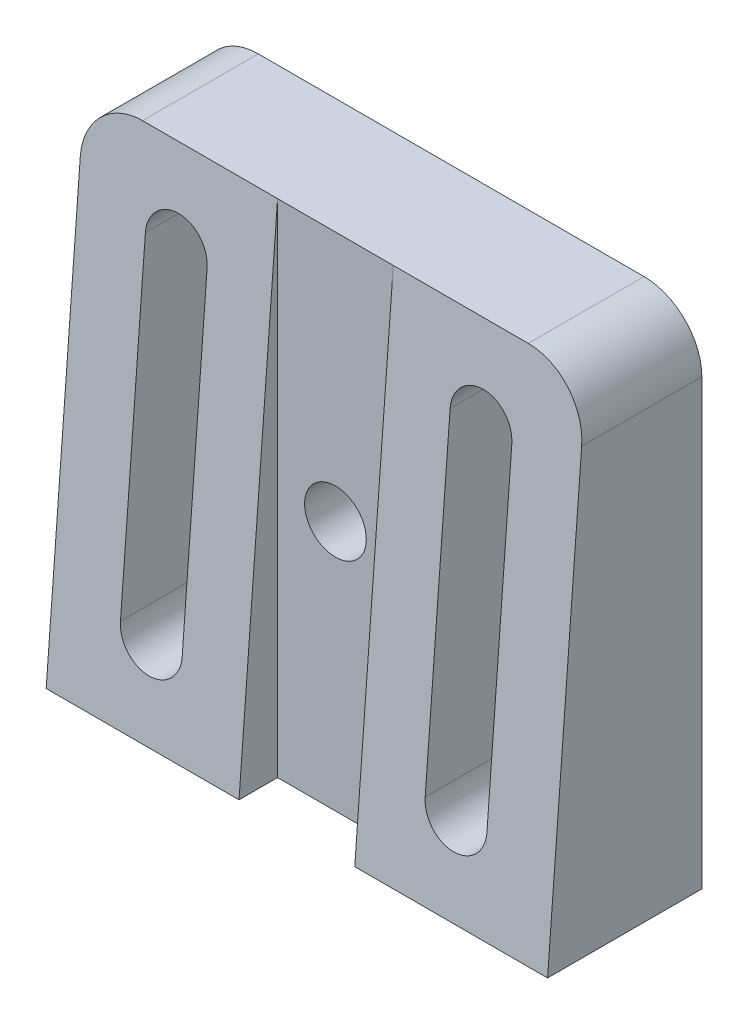
ISO-10303-21;
HEADER;
FILE_DESCRIPTION(('STEP AP214'),'2;1');
FILE_NAME('part.step','',(''),(''),'','','');
FILE_SCHEMA(('AUTOMOTIVE_DESIGN { 1 0 10303 214 1 1 1 1 }'));
ENDSEC;
DATA;
#1=APPLICATION_CONTEXT('core data for automotive mechanical design processes');
#2=APPLICATION_PROTOCOL_DEFINITION('international standard','automotive_design',2000,#1);
#3=PRODUCT_CONTEXT('',#1,'mechanical');
#4=PRODUCT('Part','Part','',(#3));
#5=PRODUCT_RELATED_PRODUCT_CATEGORY('part','',(#4));
#6=PRODUCT_DEFINITION_FORMATION('','',#4);
#7=PRODUCT_DEFINITION_CONTEXT('part definition',#1,'design');
#8=PRODUCT_DEFINITION('design','',#6,#7);
#9=PRODUCT_DEFINITION_SHAPE('','',#8);
#10=(LENGTH_UNIT() NAMED_UNIT(*) SI_UNIT(.MILLI.,.METRE.));
#11=(NAMED_UNIT(*) PLANE_ANGLE_UNIT() SI_UNIT($,.RADIAN.));
#12=(NAMED_UNIT(*) SI_UNIT($,.STERADIAN.) SOLID_ANGLE_UNIT());
#13=UNCERTAINTY_MEASURE_WITH_UNIT(LENGTH_MEASURE(1.E-05),#10,'distance_accuracy_value','');
#14=(GEOMETRIC_REPRESENTATION_CONTEXT(3) GLOBAL_UNCERTAINTY_ASSIGNED_CONTEXT((#13)) GLOBAL_UNIT_ASSIGNED_CONTEXT((#10,
#11,#12)) REPRESENTATION_CONTEXT('',''));
#15=CARTESIAN_POINT('',(0.,0.,0.));
#16=DIRECTION('',(0.,0.,1.));
#17=DIRECTION('',(1.,0.,0.));
#18=AXIS2_PLACEMENT_3D('',#15,#16,#17);
#19=CARTESIAN_POINT('',(-13.,-13.,8.));
#20=DIRECTION('',(0.,0.076696498884737,0.997054485501581));
#21=DIRECTION('',(0.,-0.997054485501582,0.0766964988847371));
#22=AXIS2_PLACEMENT_3D('',#19,#20,#21);
#23=PLANE('',#22);
#24=DIRECTION('',(0.,0.997054485501582,-0.0766964988847371));
#25=VECTOR('',#24,1.);
#26=CARTESIAN_POINT('',(-6.3,8.27411764705882,6.36352941176471));
#27=LINE('',#26,#25);
#28=CARTESIAN_POINT('',(-6.3,-8.4,7.64615384615385));
#29=VERTEX_POINT('',#28);
#30=CARTESIAN_POINT('',(-6.3,8.4,6.35384615384615));
#31=VERTEX_POINT('',#30);
#32=EDGE_CURVE('E207',#29,#31,#27,.T.);
#33=ORIENTED_EDGE('',*,*,#32,.F.);
#34=CARTESIAN_POINT('',(-7.9,-8.4,7.64615384615385));
#35=DIRECTION('',(0.,0.076696498884737,0.997054485501581));
#36=DIRECTION('',(0.,0.997054485501582,-0.0766964988847371));
#37=AXIS2_PLACEMENT_3D('',#34,#35,#36);
#38=ELLIPSE('',#37,1.60472674589604,1.6);
#39=CARTESIAN_POINT('',(-9.5,-8.4,7.64615384615385));
#40=VERTEX_POINT('',#39);
#41=EDGE_CURVE('E210',#40,#29,#38,.T.);
#42=ORIENTED_EDGE('',*,*,#41,.F.);
#43=DIRECTION('',(0.,-0.997054485501582,0.0766964988847371));
#44=VECTOR('',#43,1.);
#45=CARTESIAN_POINT('',(-9.50000000000001,8.27411764705882,6.36352941176471));
#46=LINE('',#45,#44);
#47=CARTESIAN_POINT('',(-9.50000000000001,8.4,6.35384615384615));
#48=VERTEX_POINT('',#47);
#49=EDGE_CURVE('E213',#48,#40,#46,.T.);
#50=ORIENTED_EDGE('',*,*,#49,.F.);
#51=CARTESIAN_POINT('',(-7.9,8.4,6.35384615384615));
#52=DIRECTION('',(0.,0.076696498884737,0.997054485501581));
#53=DIRECTION('',(0.,0.997054485501582,-0.0766964988847371));
#54=AXIS2_PLACEMENT_3D('',#51,#52,#53);
#55=ELLIPSE('',#54,1.60472674589604,1.6);
#56=EDGE_CURVE('E216',#31,#48,#55,.T.);
#57=ORIENTED_EDGE('',*,*,#56,.F.);
#58=EDGE_LOOP('',(#33,#42,#50,#57));
#59=FACE_BOUND('',#58,.T.);
#60=DIRECTION('',(1.,0.,0.));
#61=VECTOR('',#60,1.);
#62=CARTESIAN_POINT('',(-13.,13.,6.));
#63=LINE('',#62,#61);
#64=CARTESIAN_POINT('',(-10.,13.,6.));
#65=VERTEX_POINT('',#64);
#66=CARTESIAN_POINT('',(-3.,13.,6.));
#67=VERTEX_POINT('',#66);
#68=EDGE_CURVE('E196',#65,#67,#63,.T.);
#69=ORIENTED_EDGE('',*,*,#68,.F.);
#70=CARTESIAN_POINT('',(-10.,10.,6.23076923076923));
#71=DIRECTION('',(0.,0.076696498884737,0.997054485501581));
#72=DIRECTION('',(0.,0.997054485501582,-0.0766964988847371));
#73=AXIS2_PLACEMENT_3D('',#70,#71,#72);
#74=ELLIPSE('',#73,3.00886264855507,3.);
#75=CARTESIAN_POINT('',(-13.,10.,6.23076923076923));
#76=VERTEX_POINT('',#75);
#77=EDGE_CURVE('E12',#65,#76,#74,.T.);
#78=ORIENTED_EDGE('',*,*,#77,.T.);
#79=DIRECTION('',(0.,-0.997054485501582,0.076696498884737));
#80=VECTOR('',#79,1.);
#81=CARTESIAN_POINT('',(-13.,-13.,8.));
#82=LINE('',#81,#80);
#83=CARTESIAN_POINT('',(-13.,-13.,8.));
#84=VERTEX_POINT('',#83);
#85=EDGE_CURVE('E193',#76,#84,#82,.T.);
#86=ORIENTED_EDGE('',*,*,#85,.T.);
#87=DIRECTION('',(1.,0.,0.));
#88=VECTOR('',#87,1.);
#89=CARTESIAN_POINT('',(-13.,-13.,8.));
#90=LINE('',#89,#88);
#91=CARTESIAN_POINT('',(-3.,-13.,8.));
#92=VERTEX_POINT('',#91);
#93=EDGE_CURVE('E260',#84,#92,#90,.T.);
#94=ORIENTED_EDGE('',*,*,#93,.T.);
#95=DIRECTION('',(0.,0.997054485501582,-0.0766964988847371));
#96=VECTOR('',#95,1.);
#97=CARTESIAN_POINT('',(-3.,-13.,8.));
#98=LINE('',#97,#96);
#99=EDGE_CURVE('E161',#92,#67,#98,.T.);
#100=ORIENTED_EDGE('',*,*,#99,.T.);
#101=EDGE_LOOP('',(#69,#78,#86,#94,#100));
#102=FACE_BOUND('',#101,.T.);
#103=ADVANCED_FACE('F36',(#59,#102),#23,.T.);
#104=CARTESIAN_POINT('',(0.,0.,0.));
#105=DIRECTION('',(0.,0.,-1.));
#106=DIRECTION('',(-1.,0.,0.));
#107=AXIS2_PLACEMENT_3D('',#104,#105,#106);
#108=CYLINDRICAL_SURFACE('',#107,1.59999999999999);
#109=CARTESIAN_POINT('',(0.,0.,0.));
#110=DIRECTION('',(0.,0.,-1.));
#111=DIRECTION('',(-1.,0.,0.));
#112=AXIS2_PLACEMENT_3D('',#109,#110,#111);
#113=CIRCLE('',#112,1.59999999999999);
#114=CARTESIAN_POINT('',(-1.59999999999999,0.,0.));
#115=VERTEX_POINT('',#114);
#116=EDGE_CURVE('E166',#115,#115,#113,.T.);
#117=ORIENTED_EDGE('',*,*,#116,.T.);
#118=EDGE_LOOP('',(#117));
#119=FACE_BOUND('',#118,.T.);
#120=CARTESIAN_POINT('',(0.,0.,6.));
#121=DIRECTION('',(0.,0.,1.));
#122=DIRECTION('',(1.,0.,0.));
#123=AXIS2_PLACEMENT_3D('',#120,#121,#122);
#124=CIRCLE('',#123,1.59999999999999);
#125=CARTESIAN_POINT('',(1.59999999999999,0.,6.));
#126=VERTEX_POINT('',#125);
#127=EDGE_CURVE('E181',#126,#126,#124,.F.);
#128=ORIENTED_EDGE('',*,*,#127,.F.);
#129=EDGE_LOOP('',(#128));
#130=FACE_BOUND('',#129,.T.);
#131=ADVANCED_FACE('F336',(#119,#130),#108,.F.);
#132=CARTESIAN_POINT('',(0.,0.,0.));
#133=DIRECTION('',(0.,0.,1.));
#134=DIRECTION('',(1.,0.,0.));
#135=AXIS2_PLACEMENT_3D('',#132,#133,#134);
#136=PLANE('',#135);
#137=DIRECTION('',(-1.,0.,0.));
#138=VECTOR('',#137,1.);
#139=CARTESIAN_POINT('',(-13.,13.,0.));
#140=LINE('',#139,#138);
#141=CARTESIAN_POINT('',(9.99999999999999,13.,0.));
#142=VERTEX_POINT('',#141);
#143=CARTESIAN_POINT('',(-10.,13.,0.));
#144=VERTEX_POINT('',#143);
#145=EDGE_CURVE('E269',#142,#144,#140,.T.);
#146=ORIENTED_EDGE('',*,*,#145,.F.);
#147=CARTESIAN_POINT('',(10.,10.,0.));
#148=DIRECTION('',(0.,0.,1.));
#149=DIRECTION('',(1.,0.,0.));
#150=AXIS2_PLACEMENT_3D('',#147,#148,#149);
#151=CIRCLE('',#150,3.);
#152=CARTESIAN_POINT('',(13.,10.,0.));
#153=VERTEX_POINT('',#152);
#154=EDGE_CURVE('E291',#142,#153,#151,.F.);
#155=ORIENTED_EDGE('',*,*,#154,.T.);
#156=DIRECTION('',(0.,1.,0.));
#157=VECTOR('',#156,1.);
#158=CARTESIAN_POINT('',(13.,13.,0.));
#159=LINE('',#158,#157);
#160=CARTESIAN_POINT('',(13.,-13.,0.));
#161=VERTEX_POINT('',#160);
#162=EDGE_CURVE('E267',#161,#153,#159,.T.);
#163=ORIENTED_EDGE('',*,*,#162,.F.);
#164=DIRECTION('',(1.,0.,0.));
#165=VECTOR('',#164,1.);
#166=CARTESIAN_POINT('',(-13.,-13.,0.));
#167=LINE('',#166,#165);
#168=CARTESIAN_POINT('',(-13.,-13.,0.));
#169=VERTEX_POINT('',#168);
#170=EDGE_CURVE('E265',#169,#161,#167,.T.);
#171=ORIENTED_EDGE('',*,*,#170,.F.);
#172=DIRECTION('',(0.,-1.,0.));
#173=VECTOR('',#172,1.);
#174=CARTESIAN_POINT('',(-13.,13.,0.));
#175=LINE('',#174,#173);
#176=CARTESIAN_POINT('',(-13.,10.,0.));
#177=VERTEX_POINT('',#176);
#178=EDGE_CURVE('E259',#177,#169,#175,.T.);
#179=ORIENTED_EDGE('',*,*,#178,.F.);
#180=CARTESIAN_POINT('',(-10.,10.,0.));
#181=DIRECTION('',(0.,0.,1.));
#182=DIRECTION('',(1.,0.,0.));
#183=AXIS2_PLACEMENT_3D('',#180,#181,#182);
#184=CIRCLE('',#183,3.);
#185=EDGE_CURVE('E289',#177,#144,#184,.F.);
#186=ORIENTED_EDGE('',*,*,#185,.T.);
#187=EDGE_LOOP('',(#146,#155,#163,#171,#179,#186));
#188=FACE_BOUND('',#187,.T.);
#189=CARTESIAN_POINT('',(7.9,8.4,0.));
#190=DIRECTION('',(0.,0.,1.));
#191=DIRECTION('',(1.,0.,0.));
#192=AXIS2_PLACEMENT_3D('',#189,#190,#191);
#193=CIRCLE('',#192,1.6);
#194=CARTESIAN_POINT('',(9.50000000000001,8.4,0.));
#195=VERTEX_POINT('',#194);
#196=CARTESIAN_POINT('',(6.3,8.4,0.));
#197=VERTEX_POINT('',#196);
#198=EDGE_CURVE('E219',#195,#197,#193,.T.);
#199=ORIENTED_EDGE('',*,*,#198,.T.);
#200=DIRECTION('',(0.,-1.,0.));
#201=VECTOR('',#200,1.);
#202=CARTESIAN_POINT('',(6.3,8.4,0.));
#203=LINE('',#202,#201);
#204=CARTESIAN_POINT('',(6.30000000000001,-8.4,0.));
#205=VERTEX_POINT('',#204);
#206=EDGE_CURVE('E222',#197,#205,#203,.T.);
#207=ORIENTED_EDGE('',*,*,#206,.T.);
#208=CARTESIAN_POINT('',(7.90000000000001,-8.4,0.));
#209=DIRECTION('',(0.,0.,1.));
#210=DIRECTION('',(1.,0.,0.));
#211=AXIS2_PLACEMENT_3D('',#208,#209,#210);
#212=CIRCLE('',#211,1.6);
#213=CARTESIAN_POINT('',(9.50000000000001,-8.4,0.));
#214=VERTEX_POINT('',#213);
#215=EDGE_CURVE('E225',#205,#214,#212,.T.);
#216=ORIENTED_EDGE('',*,*,#215,.T.);
#217=DIRECTION('',(0.,1.,0.));
#218=VECTOR('',#217,1.);
#219=CARTESIAN_POINT('',(9.50000000000001,8.4,0.));
#220=LINE('',#219,#218);
#221=EDGE_CURVE('E228',#214,#195,#220,.T.);
#222=ORIENTED_EDGE('',*,*,#221,.T.);
#223=EDGE_LOOP('',(#199,#207,#216,#222));
#224=FACE_BOUND('',#223,.T.);
#225=ORIENTED_EDGE('',*,*,#116,.F.);
#226=EDGE_LOOP('',(#225));
#227=FACE_BOUND('',#226,.T.);
#228=CARTESIAN_POINT('',(-7.9,8.4,0.));
#229=DIRECTION('',(0.,0.,1.));
#230=DIRECTION('',(1.,0.,0.));
#231=AXIS2_PLACEMENT_3D('',#228,#229,#230);
#232=CIRCLE('',#231,1.6);
#233=CARTESIAN_POINT('',(-6.3,8.4,0.));
#234=VERTEX_POINT('',#233);
#235=CARTESIAN_POINT('',(-9.50000000000001,8.4,0.));
#236=VERTEX_POINT('',#235);
#237=EDGE_CURVE('E239',#234,#236,#232,.T.);
#238=ORIENTED_EDGE('',*,*,#237,.T.);
#239=DIRECTION('',(0.,-1.,0.));
#240=VECTOR('',#239,1.);
#241=CARTESIAN_POINT('',(-9.50000000000001,8.4,0.));
#242=LINE('',#241,#240);
#243=CARTESIAN_POINT('',(-9.5,-8.4,0.));
#244=VERTEX_POINT('',#243);
#245=EDGE_CURVE('E242',#236,#244,#242,.T.);
#246=ORIENTED_EDGE('',*,*,#245,.T.);
#247=CARTESIAN_POINT('',(-7.9,-8.4,0.));
#248=DIRECTION('',(0.,0.,1.));
#249=DIRECTION('',(1.,0.,0.));
#250=AXIS2_PLACEMENT_3D('',#247,#248,#249);
#251=CIRCLE('',#250,1.6);
#252=CARTESIAN_POINT('',(-6.3,-8.4,0.));
#253=VERTEX_POINT('',#252);
#254=EDGE_CURVE('E245',#244,#253,#251,.T.);
#255=ORIENTED_EDGE('',*,*,#254,.T.);
#256=DIRECTION('',(0.,1.,0.));
#257=VECTOR('',#256,1.);
#258=CARTESIAN_POINT('',(-6.3,8.4,0.));
#259=LINE('',#258,#257);
#260=EDGE_CURVE('E248',#253,#234,#259,.T.);
#261=ORIENTED_EDGE('',*,*,#260,.T.);
#262=EDGE_LOOP('',(#238,#246,#255,#261));
#263=FACE_BOUND('',#262,.T.);
#264=ADVANCED_FACE('F305',(#188,#224,#227,#263),#136,.F.);
#265=CARTESIAN_POINT('',(-13.,13.,8.));
#266=DIRECTION('',(1.,0.,0.));
#267=DIRECTION('',(0.,0.,-1.));
#268=AXIS2_PLACEMENT_3D('',#265,#266,#267);
#269=PLANE('',#268);
#270=ORIENTED_EDGE('',*,*,#85,.F.);
#271=DIRECTION('',(0.,0.,-1.));
#272=VECTOR('',#271,1.);
#273=CARTESIAN_POINT('',(-13.,10.,8.));
#274=LINE('',#273,#272);
#275=EDGE_CURVE('E44',#76,#177,#274,.T.);
#276=ORIENTED_EDGE('',*,*,#275,.T.);
#277=ORIENTED_EDGE('',*,*,#178,.T.);
#278=DIRECTION('',(0.,0.,-1.));
#279=VECTOR('',#278,1.);
#280=CARTESIAN_POINT('',(-13.,-13.,8.));
#281=LINE('',#280,#279);
#282=EDGE_CURVE('E274',#84,#169,#281,.T.);
#283=ORIENTED_EDGE('',*,*,#282,.F.);
#284=EDGE_LOOP('',(#270,#276,#277,#283));
#285=FACE_BOUND('',#284,.T.);
#286=ADVANCED_FACE('F299',(#285),#269,.F.);
#287=CARTESIAN_POINT('',(13.,13.,8.));
#288=DIRECTION('',(-1.,0.,0.));
#289=DIRECTION('',(0.,0.,1.));
#290=AXIS2_PLACEMENT_3D('',#287,#288,#289);
#291=PLANE('',#290);
#292=ORIENTED_EDGE('',*,*,#162,.T.);
#293=DIRECTION('',(0.,0.,-1.));
#294=VECTOR('',#293,1.);
#295=CARTESIAN_POINT('',(13.,10.,8.));
#296=LINE('',#295,#294);
#297=CARTESIAN_POINT('',(13.,10.,6.23076923076923));
#298=VERTEX_POINT('',#297);
#299=EDGE_CURVE('E57',#153,#298,#296,.F.);
#300=ORIENTED_EDGE('',*,*,#299,.T.);
#301=DIRECTION('',(0.,-0.997054485501582,0.076696498884737));
#302=VECTOR('',#301,1.);
#303=CARTESIAN_POINT('',(13.,-13.,8.));
#304=LINE('',#303,#302);
#305=CARTESIAN_POINT('',(13.,-13.,8.));
#306=VERTEX_POINT('',#305);
#307=EDGE_CURVE('E191',#298,#306,#304,.T.);
#308=ORIENTED_EDGE('',*,*,#307,.T.);
#309=DIRECTION('',(0.,0.,-1.));
#310=VECTOR('',#309,1.);
#311=CARTESIAN_POINT('',(13.,-13.,8.));
#312=LINE('',#311,#310);
#313=EDGE_CURVE('E262',#306,#161,#312,.T.);
#314=ORIENTED_EDGE('',*,*,#313,.T.);
#315=EDGE_LOOP('',(#292,#300,#308,#314));
#316=FACE_BOUND('',#315,.T.);
#317=ADVANCED_FACE('F315',(#316),#291,.F.);
#318=CARTESIAN_POINT('',(-13.,13.,8.));
#319=DIRECTION('',(0.,-1.,0.));
#320=DIRECTION('',(0.,0.,-1.));
#321=AXIS2_PLACEMENT_3D('',#318,#319,#320);
#322=PLANE('',#321);
#323=CARTESIAN_POINT('',(2.99999999999999,13.,6.));
#324=VERTEX_POINT('',#323);
#325=CARTESIAN_POINT('',(9.99999999999999,13.,6.));
#326=VERTEX_POINT('',#325);
#327=EDGE_CURVE('E195',#324,#326,#63,.T.);
#328=ORIENTED_EDGE('',*,*,#327,.T.);
#329=DIRECTION('',(0.,0.,-1.));
#330=VECTOR('',#329,1.);
#331=CARTESIAN_POINT('',(10.,13.,8.));
#332=LINE('',#331,#330);
#333=EDGE_CURVE('E286',#326,#142,#332,.T.);
#334=ORIENTED_EDGE('',*,*,#333,.T.);
#335=ORIENTED_EDGE('',*,*,#145,.T.);
#336=DIRECTION('',(0.,0.,-1.));
#337=VECTOR('',#336,1.);
#338=CARTESIAN_POINT('',(-10.,13.,8.));
#339=LINE('',#338,#337);
#340=EDGE_CURVE('E284',#144,#65,#339,.F.);
#341=ORIENTED_EDGE('',*,*,#340,.T.);
#342=ORIENTED_EDGE('',*,*,#68,.T.);
#343=DIRECTION('',(1.,0.,0.));
#344=VECTOR('',#343,1.);
#345=CARTESIAN_POINT('',(-3.,13.,6.));
#346=LINE('',#345,#344);
#347=EDGE_CURVE('E175',#67,#324,#346,.T.);
#348=ORIENTED_EDGE('',*,*,#347,.T.);
#349=EDGE_LOOP('',(#328,#334,#335,#341,#342,#348));
#350=FACE_BOUND('',#349,.T.);
#351=ADVANCED_FACE('F312',(#350),#322,.F.);
#352=CARTESIAN_POINT('',(-7.9,8.4,8.));
#353=DIRECTION('',(0.,0.,-1.));
#354=DIRECTION('',(-1.,0.,0.));
#355=AXIS2_PLACEMENT_3D('',#352,#353,#354);
#356=CYLINDRICAL_SURFACE('',#355,1.6);
#357=DIRECTION('',(0.,0.,-1.));
#358=VECTOR('',#357,1.);
#359=CARTESIAN_POINT('',(-6.3,8.4,8.));
#360=LINE('',#359,#358);
#361=EDGE_CURVE('E251',#31,#234,#360,.T.);
#362=ORIENTED_EDGE('',*,*,#361,.F.);
#363=ORIENTED_EDGE('',*,*,#56,.T.);
#364=DIRECTION('',(0.,0.,-1.));
#365=VECTOR('',#364,1.);
#366=CARTESIAN_POINT('',(-9.50000000000001,8.4,8.));
#367=LINE('',#366,#365);
#368=EDGE_CURVE('E257',#48,#236,#367,.T.);
#369=ORIENTED_EDGE('',*,*,#368,.T.);
#370=ORIENTED_EDGE('',*,*,#237,.F.);
#371=EDGE_LOOP('',(#362,#363,#369,#370));
#372=FACE_BOUND('',#371,.T.);
#373=ADVANCED_FACE('F385',(#372),#356,.F.);
#374=CARTESIAN_POINT('',(-9.50000000000001,8.4,8.));
#375=DIRECTION('',(1.,0.,0.));
#376=DIRECTION('',(0.,1.,0.));
#377=AXIS2_PLACEMENT_3D('',#374,#375,#376);
#378=PLANE('',#377);
#379=ORIENTED_EDGE('',*,*,#368,.F.);
#380=ORIENTED_EDGE('',*,*,#49,.T.);
#381=DIRECTION('',(0.,0.,-1.));
#382=VECTOR('',#381,1.);
#383=CARTESIAN_POINT('',(-9.5,-8.4,8.));
#384=LINE('',#383,#382);
#385=EDGE_CURVE('E255',#40,#244,#384,.T.);
#386=ORIENTED_EDGE('',*,*,#385,.T.);
#387=ORIENTED_EDGE('',*,*,#245,.F.);
#388=EDGE_LOOP('',(#379,#380,#386,#387));
#389=FACE_BOUND('',#388,.T.);
#390=ADVANCED_FACE('F489',(#389),#378,.T.);
#391=CARTESIAN_POINT('',(-7.9,-8.4,8.));
#392=DIRECTION('',(0.,0.,-1.));
#393=DIRECTION('',(-1.,0.,0.));
#394=AXIS2_PLACEMENT_3D('',#391,#392,#393);
#395=CYLINDRICAL_SURFACE('',#394,1.6);
#396=ORIENTED_EDGE('',*,*,#385,.F.);
#397=ORIENTED_EDGE('',*,*,#41,.T.);
#398=DIRECTION('',(0.,0.,-1.));
#399=VECTOR('',#398,1.);
#400=CARTESIAN_POINT('',(-6.3,-8.4,8.));
#401=LINE('',#400,#399);
#402=EDGE_CURVE('E253',#29,#253,#401,.T.);
#403=ORIENTED_EDGE('',*,*,#402,.T.);
#404=ORIENTED_EDGE('',*,*,#254,.F.);
#405=EDGE_LOOP('',(#396,#397,#403,#404));
#406=FACE_BOUND('',#405,.T.);
#407=ADVANCED_FACE('F479',(#406),#395,.F.);
#408=CARTESIAN_POINT('',(-6.3,8.4,8.));
#409=DIRECTION('',(-1.,0.,0.));
#410=DIRECTION('',(0.,-1.,0.));
#411=AXIS2_PLACEMENT_3D('',#408,#409,#410);
#412=PLANE('',#411);
#413=ORIENTED_EDGE('',*,*,#402,.F.);
#414=ORIENTED_EDGE('',*,*,#32,.T.);
#415=ORIENTED_EDGE('',*,*,#361,.T.);
#416=ORIENTED_EDGE('',*,*,#260,.F.);
#417=EDGE_LOOP('',(#413,#414,#415,#416));
#418=FACE_BOUND('',#417,.T.);
#419=ADVANCED_FACE('F469',(#418),#412,.T.);
#420=CARTESIAN_POINT('',(7.9,8.4,8.));
#421=DIRECTION('',(0.,0.,-1.));
#422=DIRECTION('',(-1.,0.,0.));
#423=AXIS2_PLACEMENT_3D('',#420,#421,#422);
#424=CYLINDRICAL_SURFACE('',#423,1.6);
#425=DIRECTION('',(0.,0.,-1.));
#426=VECTOR('',#425,1.);
#427=CARTESIAN_POINT('',(9.50000000000001,8.4,8.));
#428=LINE('',#427,#426);
#429=CARTESIAN_POINT('',(9.50000000000001,8.4,6.35384615384615));
#430=VERTEX_POINT('',#429);
#431=EDGE_CURVE('E231',#430,#195,#428,.T.);
#432=ORIENTED_EDGE('',*,*,#431,.F.);
#433=CARTESIAN_POINT('',(7.9,8.4,6.35384615384615));
#434=DIRECTION('',(0.,0.076696498884737,0.997054485501581));
#435=DIRECTION('',(0.,0.997054485501582,-0.0766964988847371));
#436=AXIS2_PLACEMENT_3D('',#433,#434,#435);
#437=ELLIPSE('',#436,1.60472674589604,1.6);
#438=CARTESIAN_POINT('',(6.3,8.4,6.35384615384615));
#439=VERTEX_POINT('',#438);
#440=EDGE_CURVE('E204',#430,#439,#437,.T.);
#441=ORIENTED_EDGE('',*,*,#440,.T.);
#442=DIRECTION('',(0.,0.,-1.));
#443=VECTOR('',#442,1.);
#444=CARTESIAN_POINT('',(6.3,8.4,8.));
#445=LINE('',#444,#443);
#446=EDGE_CURVE('E237',#439,#197,#445,.T.);
#447=ORIENTED_EDGE('',*,*,#446,.T.);
#448=ORIENTED_EDGE('',*,*,#198,.F.);
#449=EDGE_LOOP('',(#432,#441,#447,#448));
#450=FACE_BOUND('',#449,.T.);
#451=ADVANCED_FACE('F459',(#450),#424,.F.);
#452=CARTESIAN_POINT('',(6.3,8.4,8.));
#453=DIRECTION('',(1.,0.,0.));
#454=DIRECTION('',(0.,1.,0.));
#455=AXIS2_PLACEMENT_3D('',#452,#453,#454);
#456=PLANE('',#455);
#457=ORIENTED_EDGE('',*,*,#446,.F.);
#458=DIRECTION('',(0.,-0.997054485501582,0.0766964988847371));
#459=VECTOR('',#458,1.);
#460=CARTESIAN_POINT('',(6.3,8.27411764705882,6.36352941176471));
#461=LINE('',#460,#459);
#462=CARTESIAN_POINT('',(6.30000000000001,-8.4,7.64615384615385));
#463=VERTEX_POINT('',#462);
#464=EDGE_CURVE('E201',#439,#463,#461,.T.);
#465=ORIENTED_EDGE('',*,*,#464,.T.);
#466=DIRECTION('',(0.,0.,-1.));
#467=VECTOR('',#466,1.);
#468=CARTESIAN_POINT('',(6.30000000000001,-8.4,8.));
#469=LINE('',#468,#467);
#470=EDGE_CURVE('E235',#463,#205,#469,.T.);
#471=ORIENTED_EDGE('',*,*,#470,.T.);
#472=ORIENTED_EDGE('',*,*,#206,.F.);
#473=EDGE_LOOP('',(#457,#465,#471,#472));
#474=FACE_BOUND('',#473,.T.);
#475=ADVANCED_FACE('F449',(#474),#456,.T.);
#476=CARTESIAN_POINT('',(7.90000000000001,-8.4,8.));
#477=DIRECTION('',(0.,0.,-1.));
#478=DIRECTION('',(-1.,0.,0.));
#479=AXIS2_PLACEMENT_3D('',#476,#477,#478);
#480=CYLINDRICAL_SURFACE('',#479,1.6);
#481=ORIENTED_EDGE('',*,*,#470,.F.);
#482=CARTESIAN_POINT('',(7.90000000000001,-8.4,7.64615384615385));
#483=DIRECTION('',(0.,0.076696498884737,0.997054485501581));
#484=DIRECTION('',(0.,0.997054485501582,-0.0766964988847371));
#485=AXIS2_PLACEMENT_3D('',#482,#483,#484);
#486=ELLIPSE('',#485,1.60472674589604,1.6);
#487=CARTESIAN_POINT('',(9.50000000000001,-8.4,7.64615384615385));
#488=VERTEX_POINT('',#487);
#489=EDGE_CURVE('E198',#463,#488,#486,.T.);
#490=ORIENTED_EDGE('',*,*,#489,.T.);
#491=DIRECTION('',(0.,0.,-1.));
#492=VECTOR('',#491,1.);
#493=CARTESIAN_POINT('',(9.50000000000001,-8.4,8.));
#494=LINE('',#493,#492);
#495=EDGE_CURVE('E233',#488,#214,#494,.T.);
#496=ORIENTED_EDGE('',*,*,#495,.T.);
#497=ORIENTED_EDGE('',*,*,#215,.F.);
#498=EDGE_LOOP('',(#481,#490,#496,#497));
#499=FACE_BOUND('',#498,.T.);
#500=ADVANCED_FACE('F353',(#499),#480,.F.);
#501=CARTESIAN_POINT('',(9.50000000000001,8.4,8.));
#502=DIRECTION('',(-1.,0.,0.));
#503=DIRECTION('',(0.,-1.,0.));
#504=AXIS2_PLACEMENT_3D('',#501,#502,#503);
#505=PLANE('',#504);
#506=ORIENTED_EDGE('',*,*,#495,.F.);
#507=DIRECTION('',(0.,0.997054485501582,-0.0766964988847371));
#508=VECTOR('',#507,1.);
#509=CARTESIAN_POINT('',(9.50000000000001,8.27411764705882,6.36352941176471));
#510=LINE('',#509,#508);
#511=EDGE_CURVE('E277',#488,#430,#510,.T.);
#512=ORIENTED_EDGE('',*,*,#511,.T.);
#513=ORIENTED_EDGE('',*,*,#431,.T.);
#514=ORIENTED_EDGE('',*,*,#221,.F.);
#515=EDGE_LOOP('',(#506,#512,#513,#514));
#516=FACE_BOUND('',#515,.T.);
#517=ADVANCED_FACE('F348',(#516),#505,.T.);
#518=CARTESIAN_POINT('',(-13.,-13.,8.));
#519=DIRECTION('',(0.,1.,0.));
#520=DIRECTION('',(0.,0.,1.));
#521=AXIS2_PLACEMENT_3D('',#518,#519,#520);
#522=PLANE('',#521);
#523=DIRECTION('',(1.,0.,0.));
#524=VECTOR('',#523,1.);
#525=CARTESIAN_POINT('',(-3.,-13.,6.));
#526=LINE('',#525,#524);
#527=CARTESIAN_POINT('',(-3.,-13.,6.));
#528=VERTEX_POINT('',#527);
#529=CARTESIAN_POINT('',(3.,-13.,6.));
#530=VERTEX_POINT('',#529);
#531=EDGE_CURVE('E172',#528,#530,#526,.T.);
#532=ORIENTED_EDGE('',*,*,#531,.F.);
#533=DIRECTION('',(0.,0.,-1.));
#534=VECTOR('',#533,1.);
#535=CARTESIAN_POINT('',(-3.,-13.,8.));
#536=LINE('',#535,#534);
#537=EDGE_CURVE('E155',#92,#528,#536,.T.);
#538=ORIENTED_EDGE('',*,*,#537,.F.);
#539=ORIENTED_EDGE('',*,*,#93,.F.);
#540=ORIENTED_EDGE('',*,*,#282,.T.);
#541=ORIENTED_EDGE('',*,*,#170,.T.);
#542=ORIENTED_EDGE('',*,*,#313,.F.);
#543=CARTESIAN_POINT('',(3.,-13.,8.));
#544=VERTEX_POINT('',#543);
#545=EDGE_CURVE('E263',#544,#306,#90,.T.);
#546=ORIENTED_EDGE('',*,*,#545,.F.);
#547=DIRECTION('',(0.,0.,-1.));
#548=VECTOR('',#547,1.);
#549=CARTESIAN_POINT('',(3.,-13.,8.));
#550=LINE('',#549,#548);
#551=EDGE_CURVE('E167',#544,#530,#550,.T.);
#552=ORIENTED_EDGE('',*,*,#551,.T.);
#553=EDGE_LOOP('',(#532,#538,#539,#540,#541,#542,#546,#552));
#554=FACE_BOUND('',#553,.T.);
#555=ADVANCED_FACE('F179',(#554),#522,.F.);
#556=ORIENTED_EDGE('',*,*,#307,.F.);
#557=CARTESIAN_POINT('',(10.,10.,6.23076923076923));
#558=DIRECTION('',(0.,0.076696498884737,0.997054485501581));
#559=DIRECTION('',(0.,0.997054485501582,-0.0766964988847371));
#560=AXIS2_PLACEMENT_3D('',#557,#558,#559);
#561=ELLIPSE('',#560,3.00886264855507,3.);
#562=EDGE_CURVE('E294',#298,#326,#561,.T.);
#563=ORIENTED_EDGE('',*,*,#562,.T.);
#564=ORIENTED_EDGE('',*,*,#327,.F.);
#565=DIRECTION('',(0.,0.997054485501582,-0.0766964988847371));
#566=VECTOR('',#565,1.);
#567=CARTESIAN_POINT('',(3.,-13.,8.));
#568=LINE('',#567,#566);
#569=EDGE_CURVE('E279',#544,#324,#568,.T.);
#570=ORIENTED_EDGE('',*,*,#569,.F.);
#571=ORIENTED_EDGE('',*,*,#545,.T.);
#572=EDGE_LOOP('',(#556,#563,#564,#570,#571));
#573=FACE_BOUND('',#572,.T.);
#574=ORIENTED_EDGE('',*,*,#511,.F.);
#575=ORIENTED_EDGE('',*,*,#489,.F.);
#576=ORIENTED_EDGE('',*,*,#464,.F.);
#577=ORIENTED_EDGE('',*,*,#440,.F.);
#578=EDGE_LOOP('',(#574,#575,#576,#577));
#579=FACE_BOUND('',#578,.T.);
#580=ADVANCED_FACE('F320',(#573,#579),#23,.T.);
#581=CARTESIAN_POINT('',(-3.,0.,4.));
#582=DIRECTION('',(1.,0.,0.));
#583=DIRECTION('',(0.,0.,-1.));
#584=AXIS2_PLACEMENT_3D('',#581,#582,#583);
#585=PLANE('',#584);
#586=ORIENTED_EDGE('',*,*,#537,.T.);
#587=DIRECTION('',(0.,-1.,0.));
#588=VECTOR('',#587,1.);
#589=CARTESIAN_POINT('',(-3.,-13.,6.));
#590=LINE('',#589,#588);
#591=EDGE_CURVE('E158',#67,#528,#590,.T.);
#592=ORIENTED_EDGE('',*,*,#591,.F.);
#593=ORIENTED_EDGE('',*,*,#99,.F.);
#594=EDGE_LOOP('',(#586,#592,#593));
#595=FACE_BOUND('',#594,.T.);
#596=ADVANCED_FACE('F157',(#595),#585,.T.);
#597=CARTESIAN_POINT('',(3.,0.,4.));
#598=DIRECTION('',(1.,0.,0.));
#599=DIRECTION('',(0.,0.,-1.));
#600=AXIS2_PLACEMENT_3D('',#597,#598,#599);
#601=PLANE('',#600);
#602=ORIENTED_EDGE('',*,*,#569,.T.);
#603=DIRECTION('',(0.,-1.,0.));
#604=VECTOR('',#603,1.);
#605=CARTESIAN_POINT('',(3.,-13.,6.));
#606=LINE('',#605,#604);
#607=EDGE_CURVE('E176',#324,#530,#606,.T.);
#608=ORIENTED_EDGE('',*,*,#607,.T.);
#609=ORIENTED_EDGE('',*,*,#551,.F.);
#610=EDGE_LOOP('',(#602,#608,#609));
#611=FACE_BOUND('',#610,.T.);
#612=ADVANCED_FACE('F325',(#611),#601,.F.);
#613=CARTESIAN_POINT('',(-3.,-13.,6.));
#614=DIRECTION('',(0.,0.,1.));
#615=DIRECTION('',(1.,0.,0.));
#616=AXIS2_PLACEMENT_3D('',#613,#614,#615);
#617=PLANE('',#616);
#618=ORIENTED_EDGE('',*,*,#607,.F.);
#619=ORIENTED_EDGE('',*,*,#347,.F.);
#620=ORIENTED_EDGE('',*,*,#591,.T.);
#621=ORIENTED_EDGE('',*,*,#531,.T.);
#622=EDGE_LOOP('',(#618,#619,#620,#621));
#623=FACE_BOUND('',#622,.T.);
#624=ORIENTED_EDGE('',*,*,#127,.T.);
#625=EDGE_LOOP('',(#624));
#626=FACE_BOUND('',#625,.T.);
#627=ADVANCED_FACE('F170',(#623,#626),#617,.T.);
#628=CARTESIAN_POINT('',(10.,10.,8.));
#629=DIRECTION('',(0.,0.,-1.));
#630=DIRECTION('',(-1.,0.,0.));
#631=AXIS2_PLACEMENT_3D('',#628,#629,#630);
#632=CYLINDRICAL_SURFACE('',#631,3.);
#633=ORIENTED_EDGE('',*,*,#562,.F.);
#634=ORIENTED_EDGE('',*,*,#299,.F.);
#635=ORIENTED_EDGE('',*,*,#154,.F.);
#636=ORIENTED_EDGE('',*,*,#333,.F.);
#637=EDGE_LOOP('',(#633,#634,#635,#636));
#638=FACE_BOUND('',#637,.T.);
#639=ADVANCED_FACE('F317',(#638),#632,.T.);
#640=CARTESIAN_POINT('',(-10.,10.,8.));
#641=DIRECTION('',(0.,0.,-1.));
#642=DIRECTION('',(-1.,0.,0.));
#643=AXIS2_PLACEMENT_3D('',#640,#641,#642);
#644=CYLINDRICAL_SURFACE('',#643,3.);
#645=ORIENTED_EDGE('',*,*,#77,.F.);
#646=ORIENTED_EDGE('',*,*,#340,.F.);
#647=ORIENTED_EDGE('',*,*,#185,.F.);
#648=ORIENTED_EDGE('',*,*,#275,.F.);
#649=EDGE_LOOP('',(#645,#646,#647,#648));
#650=FACE_BOUND('',#649,.T.);
#651=ADVANCED_FACE('F38',(#650),#644,.T.);
#652=CLOSED_SHELL('',(#103,#131,#264,#286,#317,#351,#373,#390,#407,#419,#451,#475,#500,#517,
#555,#580,#596,#612,#627,#639,#651));
#653=MANIFOLD_SOLID_BREP('B2',#652);
#654=ADVANCED_BREP_SHAPE_REPRESENTATION('',(#18,#653),#14);
#655=SHAPE_DEFINITION_REPRESENTATION(#9,#654);
ENDSEC;
END-ISO-10303-21;
